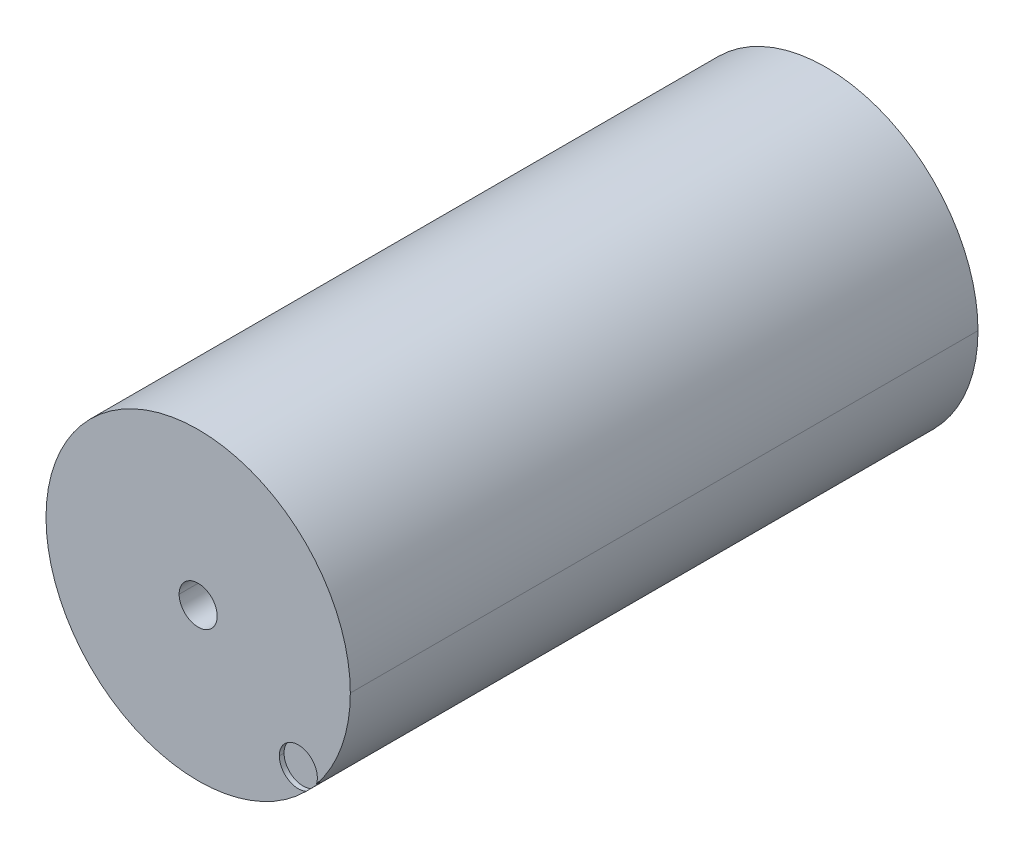
ISO-10303-21;
HEADER;
FILE_DESCRIPTION(('STEP AP214'),'2;1');
FILE_NAME('part.step','',(''),(''),'','','');
FILE_SCHEMA(('AUTOMOTIVE_DESIGN { 1 0 10303 214 1 1 1 1 }'));
ENDSEC;
DATA;
#1=APPLICATION_CONTEXT('core data for automotive mechanical design processes');
#2=APPLICATION_PROTOCOL_DEFINITION('international standard','automotive_design',2000,#1);
#3=PRODUCT_CONTEXT('',#1,'mechanical');
#4=PRODUCT('Part','Part','',(#3));
#5=PRODUCT_RELATED_PRODUCT_CATEGORY('part','',(#4));
#6=PRODUCT_DEFINITION_FORMATION('','',#4);
#7=PRODUCT_DEFINITION_CONTEXT('part definition',#1,'design');
#8=PRODUCT_DEFINITION('design','',#6,#7);
#9=PRODUCT_DEFINITION_SHAPE('','',#8);
#10=(LENGTH_UNIT() NAMED_UNIT(*) SI_UNIT(.MILLI.,.METRE.));
#11=(NAMED_UNIT(*) PLANE_ANGLE_UNIT() SI_UNIT($,.RADIAN.));
#12=(NAMED_UNIT(*) SI_UNIT($,.STERADIAN.) SOLID_ANGLE_UNIT());
#13=UNCERTAINTY_MEASURE_WITH_UNIT(LENGTH_MEASURE(1.E-05),#10,'distance_accuracy_value','');
#14=(GEOMETRIC_REPRESENTATION_CONTEXT(3) GLOBAL_UNCERTAINTY_ASSIGNED_CONTEXT((#13)) GLOBAL_UNIT_ASSIGNED_CONTEXT((#10,
#11,#12)) REPRESENTATION_CONTEXT('',''));
#15=CARTESIAN_POINT('',(0.,0.,0.));
#16=DIRECTION('',(0.,0.,1.));
#17=DIRECTION('',(1.,0.,0.));
#18=AXIS2_PLACEMENT_3D('',#15,#16,#17);
#19=CARTESIAN_POINT('',(10.5321145046291,-9.45328245563246,65.5));
#20=DIRECTION('',(0.,0.,1.));
#21=DIRECTION('',(1.,0.,0.));
#22=AXIS2_PLACEMENT_3D('',#19,#20,#21);
#23=PLANE('',#22);
#24=CARTESIAN_POINT('',(0.,0.,65.5));
#25=DIRECTION('',(0.,0.,1.));
#26=DIRECTION('',(1.,0.,0.));
#27=AXIS2_PLACEMENT_3D('',#24,#25,#26);
#28=CIRCLE('',#27,16.);
#29=CARTESIAN_POINT('',(11.3480272997679,-11.2792852789404,65.5));
#30=VERTEX_POINT('',#29);
#31=CARTESIAN_POINT('',(12.435338152409,-10.0678878139975,65.5));
#32=VERTEX_POINT('',#31);
#33=EDGE_CURVE('E31',#30,#32,#28,.T.);
#34=ORIENTED_EDGE('',*,*,#33,.T.);
#35=CARTESIAN_POINT('',(10.5321145046291,-9.45328245563246,65.5));
#36=DIRECTION('',(0.,0.,1.));
#37=DIRECTION('',(1.,0.,0.));
#38=AXIS2_PLACEMENT_3D('',#35,#36,#37);
#39=CIRCLE('',#38,2.);
#40=CARTESIAN_POINT('',(12.5321145046291,-9.45328245563246,65.5));
#41=VERTEX_POINT('',#40);
#42=EDGE_CURVE('E12',#32,#41,#39,.T.);
#43=ORIENTED_EDGE('',*,*,#42,.T.);
#44=CARTESIAN_POINT('',(10.5321145046291,-9.45328245563246,65.5));
#45=DIRECTION('',(0.,0.,1.));
#46=DIRECTION('',(1.,0.,0.));
#47=AXIS2_PLACEMENT_3D('',#44,#45,#46);
#48=CIRCLE('',#47,2.);
#49=CARTESIAN_POINT('',(8.53211450462905,-9.45328245563246,65.5));
#50=VERTEX_POINT('',#49);
#51=EDGE_CURVE('E218',#41,#50,#48,.T.);
#52=ORIENTED_EDGE('',*,*,#51,.T.);
#53=CARTESIAN_POINT('',(10.5321145046291,-9.45328245563246,65.5));
#54=DIRECTION('',(0.,0.,1.));
#55=DIRECTION('',(1.,0.,0.));
#56=AXIS2_PLACEMENT_3D('',#53,#54,#55);
#57=CIRCLE('',#56,2.);
#58=EDGE_CURVE('E210',#50,#30,#57,.T.);
#59=ORIENTED_EDGE('',*,*,#58,.T.);
#60=EDGE_LOOP('',(#34,#43,#52,#59));
#61=FACE_BOUND('',#60,.T.);
#62=ADVANCED_FACE('F19',(#61),#23,.T.);
#63=CARTESIAN_POINT('',(10.5321145046291,-9.45328245563246,65.5));
#64=DIRECTION('',(0.,0.,1.));
#65=DIRECTION('',(1.,0.,0.));
#66=AXIS2_PLACEMENT_3D('',#63,#64,#65);
#67=CYLINDRICAL_SURFACE('',#66,2.);
#68=DIRECTION('',(0.,0.,1.));
#69=VECTOR('',#68,1.);
#70=CARTESIAN_POINT('',(12.5321145046291,-9.45328245563246,65.5));
#71=LINE('',#70,#69);
#72=CARTESIAN_POINT('',(12.5321145046291,-9.45328245563246,66.));
#73=VERTEX_POINT('',#72);
#74=EDGE_CURVE('E222',#41,#73,#71,.T.);
#75=ORIENTED_EDGE('',*,*,#74,.F.);
#76=ORIENTED_EDGE('',*,*,#42,.F.);
#77=DIRECTION('',(0.,0.,-1.));
#78=VECTOR('',#77,1.);
#79=CARTESIAN_POINT('',(12.4353381524091,-10.0678878139975,67.5));
#80=LINE('',#79,#78);
#81=CARTESIAN_POINT('',(12.4353381524091,-10.0678878139975,66.));
#82=VERTEX_POINT('',#81);
#83=EDGE_CURVE('E188',#82,#32,#80,.T.);
#84=ORIENTED_EDGE('',*,*,#83,.F.);
#85=CARTESIAN_POINT('',(10.5321145046291,-9.45328245563246,66.));
#86=DIRECTION('',(0.,0.,1.));
#87=DIRECTION('',(1.,0.,0.));
#88=AXIS2_PLACEMENT_3D('',#85,#86,#87);
#89=CIRCLE('',#88,2.);
#90=EDGE_CURVE('E136',#82,#73,#89,.T.);
#91=ORIENTED_EDGE('',*,*,#90,.T.);
#92=EDGE_LOOP('',(#75,#76,#84,#91));
#93=FACE_BOUND('',#92,.T.);
#94=ADVANCED_FACE('F21',(#93),#67,.F.);
#95=CARTESIAN_POINT('',(0.,0.,66.));
#96=DIRECTION('',(0.,0.,-1.));
#97=DIRECTION('',(-1.,0.,0.));
#98=AXIS2_PLACEMENT_3D('',#95,#96,#97);
#99=CYLINDRICAL_SURFACE('',#98,2.);
#100=DIRECTION('',(0.,0.,-1.));
#101=VECTOR('',#100,1.);
#102=CARTESIAN_POINT('',(2.,0.,66.));
#103=LINE('',#102,#101);
#104=CARTESIAN_POINT('',(2.,0.,66.));
#105=VERTEX_POINT('',#104);
#106=CARTESIAN_POINT('',(2.,0.,0.));
#107=VERTEX_POINT('',#106);
#108=EDGE_CURVE('E165',#105,#107,#103,.T.);
#109=ORIENTED_EDGE('',*,*,#108,.F.);
#110=CARTESIAN_POINT('',(0.,0.,66.));
#111=DIRECTION('',(0.,0.,1.));
#112=DIRECTION('',(1.,0.,0.));
#113=AXIS2_PLACEMENT_3D('',#110,#111,#112);
#114=CIRCLE('',#113,2.);
#115=CARTESIAN_POINT('',(-2.,0.,66.));
#116=VERTEX_POINT('',#115);
#117=EDGE_CURVE('E129',#105,#116,#114,.T.);
#118=ORIENTED_EDGE('',*,*,#117,.T.);
#119=DIRECTION('',(0.,0.,-1.));
#120=VECTOR('',#119,1.);
#121=CARTESIAN_POINT('',(-2.,0.,66.));
#122=LINE('',#121,#120);
#123=CARTESIAN_POINT('',(-2.,0.,0.));
#124=VERTEX_POINT('',#123);
#125=EDGE_CURVE('E185',#116,#124,#122,.T.);
#126=ORIENTED_EDGE('',*,*,#125,.T.);
#127=CARTESIAN_POINT('',(0.,0.,0.));
#128=DIRECTION('',(0.,0.,1.));
#129=DIRECTION('',(1.,0.,0.));
#130=AXIS2_PLACEMENT_3D('',#127,#128,#129);
#131=CIRCLE('',#130,2.);
#132=EDGE_CURVE('E128',#107,#124,#131,.T.);
#133=ORIENTED_EDGE('',*,*,#132,.F.);
#134=EDGE_LOOP('',(#109,#118,#126,#133));
#135=FACE_BOUND('',#134,.T.);
#136=ADVANCED_FACE('F248',(#135),#99,.F.);
#137=CARTESIAN_POINT('',(0.,0.,66.));
#138=DIRECTION('',(0.,0.,-1.));
#139=DIRECTION('',(-1.,0.,0.));
#140=AXIS2_PLACEMENT_3D('',#137,#138,#139);
#141=CYLINDRICAL_SURFACE('',#140,16.);
#142=DIRECTION('',(0.,0.,-1.));
#143=VECTOR('',#142,1.);
#144=CARTESIAN_POINT('',(16.,0.,66.));
#145=LINE('',#144,#143);
#146=CARTESIAN_POINT('',(16.,0.,66.));
#147=VERTEX_POINT('',#146);
#148=CARTESIAN_POINT('',(16.,0.,0.));
#149=VERTEX_POINT('',#148);
#150=EDGE_CURVE('E138',#147,#149,#145,.T.);
#151=ORIENTED_EDGE('',*,*,#150,.F.);
#152=CARTESIAN_POINT('',(0.,0.,66.));
#153=DIRECTION('',(0.,0.,1.));
#154=DIRECTION('',(1.,0.,0.));
#155=AXIS2_PLACEMENT_3D('',#152,#153,#154);
#156=CIRCLE('',#155,16.);
#157=EDGE_CURVE('E149',#82,#147,#156,.T.);
#158=ORIENTED_EDGE('',*,*,#157,.F.);
#159=ORIENTED_EDGE('',*,*,#83,.T.);
#160=ORIENTED_EDGE('',*,*,#33,.F.);
#161=DIRECTION('',(0.,0.,1.));
#162=VECTOR('',#161,1.);
#163=CARTESIAN_POINT('',(11.3480272997678,-11.2792852789405,67.5));
#164=LINE('',#163,#162);
#165=CARTESIAN_POINT('',(11.3480272997678,-11.2792852789405,66.));
#166=VERTEX_POINT('',#165);
#167=EDGE_CURVE('E200',#30,#166,#164,.T.);
#168=ORIENTED_EDGE('',*,*,#167,.T.);
#169=CARTESIAN_POINT('',(0.,0.,66.));
#170=DIRECTION('',(0.,0.,1.));
#171=DIRECTION('',(1.,0.,0.));
#172=AXIS2_PLACEMENT_3D('',#169,#170,#171);
#173=CIRCLE('',#172,16.);
#174=CARTESIAN_POINT('',(-16.,0.,66.));
#175=VERTEX_POINT('',#174);
#176=EDGE_CURVE('E82',#175,#166,#173,.T.);
#177=ORIENTED_EDGE('',*,*,#176,.F.);
#178=DIRECTION('',(0.,0.,-1.));
#179=VECTOR('',#178,1.);
#180=CARTESIAN_POINT('',(-16.,0.,66.));
#181=LINE('',#180,#179);
#182=CARTESIAN_POINT('',(-16.,0.,0.));
#183=VERTEX_POINT('',#182);
#184=EDGE_CURVE('E23',#175,#183,#181,.T.);
#185=ORIENTED_EDGE('',*,*,#184,.T.);
#186=CARTESIAN_POINT('',(0.,0.,0.));
#187=DIRECTION('',(0.,0.,1.));
#188=DIRECTION('',(1.,0.,0.));
#189=AXIS2_PLACEMENT_3D('',#186,#187,#188);
#190=CIRCLE('',#189,16.);
#191=EDGE_CURVE('E118',#183,#149,#190,.T.);
#192=ORIENTED_EDGE('',*,*,#191,.T.);
#193=EDGE_LOOP('',(#151,#158,#159,#160,#168,#177,#185,#192));
#194=FACE_BOUND('',#193,.T.);
#195=ADVANCED_FACE('F132',(#194),#141,.T.);
#196=CARTESIAN_POINT('',(0.,0.,0.));
#197=DIRECTION('',(0.,0.,1.));
#198=DIRECTION('',(1.,0.,0.));
#199=AXIS2_PLACEMENT_3D('',#196,#197,#198);
#200=PLANE('',#199);
#201=CARTESIAN_POINT('',(0.,0.,0.));
#202=DIRECTION('',(0.,0.,1.));
#203=DIRECTION('',(1.,0.,0.));
#204=AXIS2_PLACEMENT_3D('',#201,#202,#203);
#205=CIRCLE('',#204,2.);
#206=EDGE_CURVE('E170',#124,#107,#205,.T.);
#207=ORIENTED_EDGE('',*,*,#206,.T.);
#208=ORIENTED_EDGE('',*,*,#132,.T.);
#209=EDGE_LOOP('',(#207,#208));
#210=FACE_BOUND('',#209,.T.);
#211=ORIENTED_EDGE('',*,*,#191,.F.);
#212=CARTESIAN_POINT('',(0.,0.,0.));
#213=DIRECTION('',(0.,0.,1.));
#214=DIRECTION('',(1.,0.,0.));
#215=AXIS2_PLACEMENT_3D('',#212,#213,#214);
#216=CIRCLE('',#215,16.);
#217=EDGE_CURVE('E125',#149,#183,#216,.T.);
#218=ORIENTED_EDGE('',*,*,#217,.F.);
#219=EDGE_LOOP('',(#211,#218));
#220=FACE_BOUND('',#219,.T.);
#221=ADVANCED_FACE('F123',(#210,#220),#200,.F.);
#222=CARTESIAN_POINT('',(0.,0.,66.));
#223=DIRECTION('',(0.,0.,1.));
#224=DIRECTION('',(1.,0.,0.));
#225=AXIS2_PLACEMENT_3D('',#222,#223,#224);
#226=PLANE('',#225);
#227=CARTESIAN_POINT('',(0.,0.,66.));
#228=DIRECTION('',(0.,0.,1.));
#229=DIRECTION('',(1.,0.,0.));
#230=AXIS2_PLACEMENT_3D('',#227,#228,#229);
#231=CIRCLE('',#230,2.);
#232=EDGE_CURVE('E171',#116,#105,#231,.T.);
#233=ORIENTED_EDGE('',*,*,#232,.F.);
#234=ORIENTED_EDGE('',*,*,#117,.F.);
#235=EDGE_LOOP('',(#233,#234));
#236=FACE_BOUND('',#235,.T.);
#237=ORIENTED_EDGE('',*,*,#90,.F.);
#238=ORIENTED_EDGE('',*,*,#157,.T.);
#239=CARTESIAN_POINT('',(0.,0.,66.));
#240=DIRECTION('',(0.,0.,1.));
#241=DIRECTION('',(1.,0.,0.));
#242=AXIS2_PLACEMENT_3D('',#239,#240,#241);
#243=CIRCLE('',#242,16.);
#244=EDGE_CURVE('E144',#147,#175,#243,.T.);
#245=ORIENTED_EDGE('',*,*,#244,.T.);
#246=ORIENTED_EDGE('',*,*,#176,.T.);
#247=CARTESIAN_POINT('',(10.5321145046291,-9.45328245563246,66.));
#248=DIRECTION('',(0.,0.,1.));
#249=DIRECTION('',(1.,0.,0.));
#250=AXIS2_PLACEMENT_3D('',#247,#248,#249);
#251=CIRCLE('',#250,2.);
#252=CARTESIAN_POINT('',(8.53211450462905,-9.45328245563246,66.));
#253=VERTEX_POINT('',#252);
#254=EDGE_CURVE('E224',#253,#166,#251,.T.);
#255=ORIENTED_EDGE('',*,*,#254,.F.);
#256=CARTESIAN_POINT('',(10.5321145046291,-9.45328245563246,66.));
#257=DIRECTION('',(0.,0.,1.));
#258=DIRECTION('',(1.,0.,0.));
#259=AXIS2_PLACEMENT_3D('',#256,#257,#258);
#260=CIRCLE('',#259,2.);
#261=EDGE_CURVE('E97',#73,#253,#260,.T.);
#262=ORIENTED_EDGE('',*,*,#261,.F.);
#263=EDGE_LOOP('',(#237,#238,#245,#246,#255,#262));
#264=FACE_BOUND('',#263,.T.);
#265=ADVANCED_FACE('F244',(#236,#264),#226,.T.);
#266=CARTESIAN_POINT('',(0.,0.,66.));
#267=DIRECTION('',(0.,0.,-1.));
#268=DIRECTION('',(-1.,0.,0.));
#269=AXIS2_PLACEMENT_3D('',#266,#267,#268);
#270=CYLINDRICAL_SURFACE('',#269,16.);
#271=ORIENTED_EDGE('',*,*,#244,.F.);
#272=ORIENTED_EDGE('',*,*,#150,.T.);
#273=ORIENTED_EDGE('',*,*,#217,.T.);
#274=ORIENTED_EDGE('',*,*,#184,.F.);
#275=EDGE_LOOP('',(#271,#272,#273,#274));
#276=FACE_BOUND('',#275,.T.);
#277=ADVANCED_FACE('F137',(#276),#270,.T.);
#278=CARTESIAN_POINT('',(0.,0.,66.));
#279=DIRECTION('',(0.,0.,-1.));
#280=DIRECTION('',(-1.,0.,0.));
#281=AXIS2_PLACEMENT_3D('',#278,#279,#280);
#282=CYLINDRICAL_SURFACE('',#281,2.);
#283=ORIENTED_EDGE('',*,*,#232,.T.);
#284=ORIENTED_EDGE('',*,*,#108,.T.);
#285=ORIENTED_EDGE('',*,*,#206,.F.);
#286=ORIENTED_EDGE('',*,*,#125,.F.);
#287=EDGE_LOOP('',(#283,#284,#285,#286));
#288=FACE_BOUND('',#287,.T.);
#289=ADVANCED_FACE('F265',(#288),#282,.F.);
#290=CARTESIAN_POINT('',(10.5321145046291,-9.45328245563246,65.5));
#291=DIRECTION('',(0.,0.,1.));
#292=DIRECTION('',(1.,0.,0.));
#293=AXIS2_PLACEMENT_3D('',#290,#291,#292);
#294=CYLINDRICAL_SURFACE('',#293,2.);
#295=DIRECTION('',(0.,0.,1.));
#296=VECTOR('',#295,1.);
#297=CARTESIAN_POINT('',(8.53211450462905,-9.45328245563246,65.5));
#298=LINE('',#297,#296);
#299=EDGE_CURVE('E172',#50,#253,#298,.T.);
#300=ORIENTED_EDGE('',*,*,#299,.F.);
#301=ORIENTED_EDGE('',*,*,#51,.F.);
#302=ORIENTED_EDGE('',*,*,#74,.T.);
#303=ORIENTED_EDGE('',*,*,#261,.T.);
#304=EDGE_LOOP('',(#300,#301,#302,#303));
#305=FACE_BOUND('',#304,.T.);
#306=ADVANCED_FACE('F262',(#305),#294,.F.);
#307=CARTESIAN_POINT('',(10.5321145046291,-9.45328245563246,65.5));
#308=DIRECTION('',(0.,0.,1.));
#309=DIRECTION('',(1.,0.,0.));
#310=AXIS2_PLACEMENT_3D('',#307,#308,#309);
#311=CYLINDRICAL_SURFACE('',#310,2.);
#312=ORIENTED_EDGE('',*,*,#58,.F.);
#313=ORIENTED_EDGE('',*,*,#299,.T.);
#314=ORIENTED_EDGE('',*,*,#254,.T.);
#315=ORIENTED_EDGE('',*,*,#167,.F.);
#316=EDGE_LOOP('',(#312,#313,#314,#315));
#317=FACE_BOUND('',#316,.T.);
#318=ADVANCED_FACE('F269',(#317),#311,.F.);
#319=CLOSED_SHELL('',(#62,#94,#136,#195,#221,#265,#277,#289,#306,#318));
#320=MANIFOLD_SOLID_BREP('B1',#319);
#321=ADVANCED_BREP_SHAPE_REPRESENTATION('',(#18,#320),#14);
#322=SHAPE_DEFINITION_REPRESENTATION(#9,#321);
ENDSEC;
END-ISO-10303-21;
